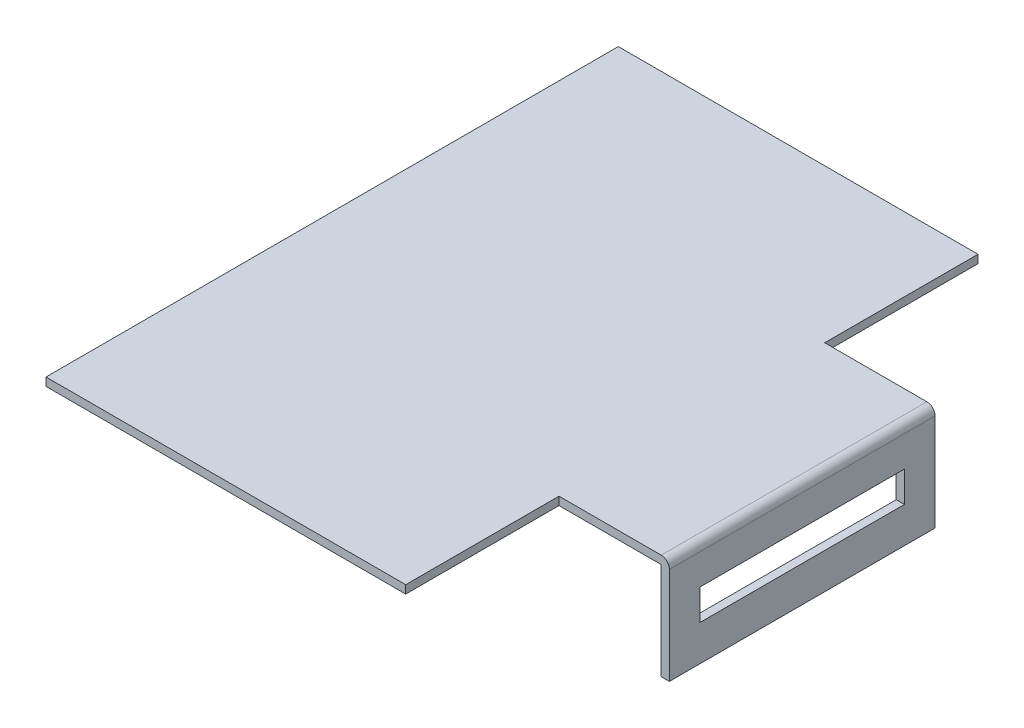
ISO-10303-21;
HEADER;
FILE_DESCRIPTION(('STEP AP214'),'2;1');
FILE_NAME('part.step','',(''),(''),'','','');
FILE_SCHEMA(('AUTOMOTIVE_DESIGN { 1 0 10303 214 1 1 1 1 }'));
ENDSEC;
DATA;
#1=APPLICATION_CONTEXT('core data for automotive mechanical design processes');
#2=APPLICATION_PROTOCOL_DEFINITION('international standard','automotive_design',2000,#1);
#3=PRODUCT_CONTEXT('',#1,'mechanical');
#4=PRODUCT('Part','Part','',(#3));
#5=PRODUCT_RELATED_PRODUCT_CATEGORY('part','',(#4));
#6=PRODUCT_DEFINITION_FORMATION('','',#4);
#7=PRODUCT_DEFINITION_CONTEXT('part definition',#1,'design');
#8=PRODUCT_DEFINITION('design','',#6,#7);
#9=PRODUCT_DEFINITION_SHAPE('','',#8);
#10=(LENGTH_UNIT() NAMED_UNIT(*) SI_UNIT(.MILLI.,.METRE.));
#11=(NAMED_UNIT(*) PLANE_ANGLE_UNIT() SI_UNIT($,.RADIAN.));
#12=(NAMED_UNIT(*) SI_UNIT($,.STERADIAN.) SOLID_ANGLE_UNIT());
#13=UNCERTAINTY_MEASURE_WITH_UNIT(LENGTH_MEASURE(1.E-05),#10,'distance_accuracy_value','');
#14=(GEOMETRIC_REPRESENTATION_CONTEXT(3) GLOBAL_UNCERTAINTY_ASSIGNED_CONTEXT((#13)) GLOBAL_UNIT_ASSIGNED_CONTEXT((#10,
#11,#12)) REPRESENTATION_CONTEXT('',''));
#15=CARTESIAN_POINT('',(0.,0.,0.));
#16=DIRECTION('',(0.,0.,1.));
#17=DIRECTION('',(1.,0.,0.));
#18=AXIS2_PLACEMENT_3D('',#15,#16,#17);
#19=CARTESIAN_POINT('',(11.1,-1.90000000000001,-5.));
#20=DIRECTION('',(0.,0.,-1.));
#21=DIRECTION('',(0.,1.,0.));
#22=AXIS2_PLACEMENT_3D('',#19,#20,#21);
#23=PLANE('',#22);
#24=DIRECTION('',(-1.,0.,0.));
#25=VECTOR('',#24,1.);
#26=CARTESIAN_POINT('',(11.1,-1.90000000000001,-5.));
#27=LINE('',#26,#25);
#28=CARTESIAN_POINT('',(11.5,-1.90000000000001,-5.));
#29=VERTEX_POINT('',#28);
#30=CARTESIAN_POINT('',(11.1,-1.90000000000001,-5.));
#31=VERTEX_POINT('',#30);
#32=EDGE_CURVE('E275',#29,#31,#27,.T.);
#33=ORIENTED_EDGE('',*,*,#32,.T.);
#34=DIRECTION('',(0.,-1.,0.));
#35=VECTOR('',#34,1.);
#36=CARTESIAN_POINT('',(11.1,0.,-5.));
#37=LINE('',#36,#35);
#38=CARTESIAN_POINT('',(11.1,-3.40000000000001,-5.));
#39=VERTEX_POINT('',#38);
#40=EDGE_CURVE('E212',#39,#31,#37,.F.);
#41=ORIENTED_EDGE('',*,*,#40,.F.);
#42=DIRECTION('',(1.,0.,0.));
#43=VECTOR('',#42,1.);
#44=CARTESIAN_POINT('',(11.1,-3.40000000000001,-5.));
#45=LINE('',#44,#43);
#46=CARTESIAN_POINT('',(11.5,-3.4,-5.));
#47=VERTEX_POINT('',#46);
#48=EDGE_CURVE('E261',#39,#47,#45,.T.);
#49=ORIENTED_EDGE('',*,*,#48,.T.);
#50=DIRECTION('',(0.,-1.,0.));
#51=VECTOR('',#50,1.);
#52=CARTESIAN_POINT('',(11.5,0.,-5.));
#53=LINE('',#52,#51);
#54=EDGE_CURVE('E202',#47,#29,#53,.F.);
#55=ORIENTED_EDGE('',*,*,#54,.T.);
#56=EDGE_LOOP('',(#33,#41,#49,#55));
#57=FACE_BOUND('',#56,.T.);
#58=ADVANCED_FACE('F17',(#57),#23,.F.);
#59=CARTESIAN_POINT('',(11.1,-1.90000000000001,5.));
#60=DIRECTION('',(0.,1.,0.));
#61=DIRECTION('',(-1.,0.,0.));
#62=AXIS2_PLACEMENT_3D('',#59,#60,#61);
#63=PLANE('',#62);
#64=DIRECTION('',(1.,0.,0.));
#65=VECTOR('',#64,1.);
#66=CARTESIAN_POINT('',(11.1,-1.9,5.));
#67=LINE('',#66,#65);
#68=CARTESIAN_POINT('',(11.5,-1.90000000000001,5.));
#69=VERTEX_POINT('',#68);
#70=CARTESIAN_POINT('',(11.1,-1.90000000000001,5.));
#71=VERTEX_POINT('',#70);
#72=EDGE_CURVE('E272',#69,#71,#67,.F.);
#73=ORIENTED_EDGE('',*,*,#72,.T.);
#74=DIRECTION('',(0.,0.,1.));
#75=VECTOR('',#74,1.);
#76=CARTESIAN_POINT('',(11.1,-1.90000000000001,0.));
#77=LINE('',#76,#75);
#78=EDGE_CURVE('E205',#31,#71,#77,.T.);
#79=ORIENTED_EDGE('',*,*,#78,.F.);
#80=ORIENTED_EDGE('',*,*,#32,.F.);
#81=DIRECTION('',(0.,0.,1.));
#82=VECTOR('',#81,1.);
#83=CARTESIAN_POINT('',(11.5,-1.9,0.));
#84=LINE('',#83,#82);
#85=EDGE_CURVE('E199',#29,#69,#84,.T.);
#86=ORIENTED_EDGE('',*,*,#85,.T.);
#87=EDGE_LOOP('',(#73,#79,#80,#86));
#88=FACE_BOUND('',#87,.T.);
#89=ADVANCED_FACE('F371',(#88),#63,.F.);
#90=CARTESIAN_POINT('',(11.1,-1.90000000000001,5.));
#91=DIRECTION('',(0.,0.,1.));
#92=DIRECTION('',(0.,-1.,0.));
#93=AXIS2_PLACEMENT_3D('',#90,#91,#92);
#94=PLANE('',#93);
#95=DIRECTION('',(1.,0.,0.));
#96=VECTOR('',#95,1.);
#97=CARTESIAN_POINT('',(11.1,-3.40000000000001,5.));
#98=LINE('',#97,#96);
#99=CARTESIAN_POINT('',(11.5,-3.40000000000001,5.));
#100=VERTEX_POINT('',#99);
#101=CARTESIAN_POINT('',(11.1,-3.40000000000001,5.));
#102=VERTEX_POINT('',#101);
#103=EDGE_CURVE('E269',#100,#102,#98,.F.);
#104=ORIENTED_EDGE('',*,*,#103,.T.);
#105=DIRECTION('',(0.,-1.,0.));
#106=VECTOR('',#105,1.);
#107=CARTESIAN_POINT('',(11.1,0.,5.));
#108=LINE('',#107,#106);
#109=EDGE_CURVE('E218',#71,#102,#108,.T.);
#110=ORIENTED_EDGE('',*,*,#109,.F.);
#111=ORIENTED_EDGE('',*,*,#72,.F.);
#112=DIRECTION('',(0.,-1.,0.));
#113=VECTOR('',#112,1.);
#114=CARTESIAN_POINT('',(11.5,0.,5.));
#115=LINE('',#114,#113);
#116=EDGE_CURVE('E196',#69,#100,#115,.T.);
#117=ORIENTED_EDGE('',*,*,#116,.T.);
#118=EDGE_LOOP('',(#104,#110,#111,#117));
#119=FACE_BOUND('',#118,.T.);
#120=ADVANCED_FACE('F326',(#119),#94,.F.);
#121=CARTESIAN_POINT('',(11.1,-3.40000000000001,5.));
#122=DIRECTION('',(0.,-1.,0.));
#123=DIRECTION('',(1.,0.,0.));
#124=AXIS2_PLACEMENT_3D('',#121,#122,#123);
#125=PLANE('',#124);
#126=ORIENTED_EDGE('',*,*,#48,.F.);
#127=DIRECTION('',(0.,0.,1.));
#128=VECTOR('',#127,1.);
#129=CARTESIAN_POINT('',(11.1,-3.40000000000001,0.));
#130=LINE('',#129,#128);
#131=EDGE_CURVE('E215',#102,#39,#130,.F.);
#132=ORIENTED_EDGE('',*,*,#131,.F.);
#133=ORIENTED_EDGE('',*,*,#103,.F.);
#134=DIRECTION('',(0.,0.,1.));
#135=VECTOR('',#134,1.);
#136=CARTESIAN_POINT('',(11.5,-3.4,0.));
#137=LINE('',#136,#135);
#138=EDGE_CURVE('E193',#100,#47,#137,.F.);
#139=ORIENTED_EDGE('',*,*,#138,.T.);
#140=EDGE_LOOP('',(#126,#132,#133,#139));
#141=FACE_BOUND('',#140,.T.);
#142=ADVANCED_FACE('F318',(#141),#125,.F.);
#143=CARTESIAN_POINT('',(11.5,-5.15,-14.));
#144=DIRECTION('',(0.,1.,0.));
#145=DIRECTION('',(-1.,0.,0.));
#146=AXIS2_PLACEMENT_3D('',#143,#144,#145);
#147=PLANE('',#146);
#148=DIRECTION('',(-1.,0.,0.));
#149=VECTOR('',#148,1.);
#150=CARTESIAN_POINT('',(11.5,-5.15,6.5));
#151=LINE('',#150,#149);
#152=CARTESIAN_POINT('',(11.1,-5.15000000000001,6.5));
#153=VERTEX_POINT('',#152);
#154=CARTESIAN_POINT('',(11.5,-5.15,6.5));
#155=VERTEX_POINT('',#154);
#156=EDGE_CURVE('E252',#153,#155,#151,.F.);
#157=ORIENTED_EDGE('',*,*,#156,.F.);
#158=DIRECTION('',(0.,0.,1.));
#159=VECTOR('',#158,1.);
#160=CARTESIAN_POINT('',(11.1,-5.15000000000002,0.));
#161=LINE('',#160,#159);
#162=CARTESIAN_POINT('',(11.1,-5.15000000000001,-6.5));
#163=VERTEX_POINT('',#162);
#164=EDGE_CURVE('E221',#163,#153,#161,.T.);
#165=ORIENTED_EDGE('',*,*,#164,.F.);
#166=DIRECTION('',(-1.,0.,0.));
#167=VECTOR('',#166,1.);
#168=CARTESIAN_POINT('',(11.5,-5.15,-6.5));
#169=LINE('',#168,#167);
#170=CARTESIAN_POINT('',(11.5,-5.15000000000001,-6.5));
#171=VERTEX_POINT('',#170);
#172=EDGE_CURVE('E259',#171,#163,#169,.T.);
#173=ORIENTED_EDGE('',*,*,#172,.F.);
#174=DIRECTION('',(0.,0.,1.));
#175=VECTOR('',#174,1.);
#176=CARTESIAN_POINT('',(11.5,-5.15000000000001,0.));
#177=LINE('',#176,#175);
#178=EDGE_CURVE('E192',#171,#155,#177,.T.);
#179=ORIENTED_EDGE('',*,*,#178,.T.);
#180=EDGE_LOOP('',(#157,#165,#173,#179));
#181=FACE_BOUND('',#180,.T.);
#182=ADVANCED_FACE('F315',(#181),#147,.F.);
#183=CARTESIAN_POINT('',(0.,-0.399999999999999,0.));
#184=DIRECTION('',(0.,-1.,0.));
#185=DIRECTION('',(1.,0.,0.));
#186=AXIS2_PLACEMENT_3D('',#183,#184,#185);
#187=PLANE('',#186);
#188=DIRECTION('',(0.,0.,1.));
#189=VECTOR('',#188,1.);
#190=CARTESIAN_POINT('',(-11.5,-0.400000000000003,14.));
#191=LINE('',#190,#189);
#192=CARTESIAN_POINT('',(-11.5,-0.4,-14.));
#193=VERTEX_POINT('',#192);
#194=CARTESIAN_POINT('',(-11.5,-0.400000000000003,14.));
#195=VERTEX_POINT('',#194);
#196=EDGE_CURVE('E165',#193,#195,#191,.T.);
#197=ORIENTED_EDGE('',*,*,#196,.F.);
#198=DIRECTION('',(1.,0.,0.));
#199=VECTOR('',#198,1.);
#200=CARTESIAN_POINT('',(-11.5,-0.399999999999999,-14.));
#201=LINE('',#200,#199);
#202=CARTESIAN_POINT('',(6.09999999999999,-0.399999999999999,-14.));
#203=VERTEX_POINT('',#202);
#204=EDGE_CURVE('E155',#203,#193,#201,.F.);
#205=ORIENTED_EDGE('',*,*,#204,.F.);
#206=DIRECTION('',(0.,0.,1.));
#207=VECTOR('',#206,1.);
#208=CARTESIAN_POINT('',(6.09999999999999,-0.399999999999999,-6.5));
#209=LINE('',#208,#207);
#210=CARTESIAN_POINT('',(6.09999999999999,-0.399999999999999,-6.5));
#211=VERTEX_POINT('',#210);
#212=EDGE_CURVE('E135',#203,#211,#209,.T.);
#213=ORIENTED_EDGE('',*,*,#212,.T.);
#214=DIRECTION('',(1.,0.,0.));
#215=VECTOR('',#214,1.);
#216=CARTESIAN_POINT('',(11.1,-0.399999999999999,-6.5));
#217=LINE('',#216,#215);
#218=CARTESIAN_POINT('',(11.1,-0.400000000000002,-6.5));
#219=VERTEX_POINT('',#218);
#220=EDGE_CURVE('E134',#211,#219,#217,.T.);
#221=ORIENTED_EDGE('',*,*,#220,.T.);
#222=DIRECTION('',(0.,0.,1.));
#223=VECTOR('',#222,1.);
#224=CARTESIAN_POINT('',(11.1,-0.400000000000005,0.));
#225=LINE('',#224,#223);
#226=CARTESIAN_POINT('',(11.1,-0.400000000000005,6.5));
#227=VERTEX_POINT('',#226);
#228=EDGE_CURVE('E250',#227,#219,#225,.F.);
#229=ORIENTED_EDGE('',*,*,#228,.F.);
#230=DIRECTION('',(1.,0.,0.));
#231=VECTOR('',#230,1.);
#232=CARTESIAN_POINT('',(11.1,-0.400000000000005,6.5));
#233=LINE('',#232,#231);
#234=CARTESIAN_POINT('',(6.09999999999999,-0.400000000000001,6.5));
#235=VERTEX_POINT('',#234);
#236=EDGE_CURVE('E111',#227,#235,#233,.F.);
#237=ORIENTED_EDGE('',*,*,#236,.T.);
#238=DIRECTION('',(0.,0.,1.));
#239=VECTOR('',#238,1.);
#240=CARTESIAN_POINT('',(6.09999999999999,-0.399999999999999,14.));
#241=LINE('',#240,#239);
#242=CARTESIAN_POINT('',(6.09999999999998,-0.400000000000002,14.));
#243=VERTEX_POINT('',#242);
#244=EDGE_CURVE('E175',#235,#243,#241,.T.);
#245=ORIENTED_EDGE('',*,*,#244,.T.);
#246=DIRECTION('',(1.,0.,0.));
#247=VECTOR('',#246,1.);
#248=CARTESIAN_POINT('',(-11.5,-0.400000000000003,14.));
#249=LINE('',#248,#247);
#250=EDGE_CURVE('E174',#195,#243,#249,.T.);
#251=ORIENTED_EDGE('',*,*,#250,.F.);
#252=EDGE_LOOP('',(#197,#205,#213,#221,#229,#237,#245,#251));
#253=FACE_BOUND('',#252,.T.);
#254=ADVANCED_FACE('F317',(#253),#187,.T.);
#255=CARTESIAN_POINT('',(11.1,0.,0.));
#256=DIRECTION('',(-1.,0.,0.));
#257=DIRECTION('',(0.,-1.,0.));
#258=AXIS2_PLACEMENT_3D('',#255,#256,#257);
#259=PLANE('',#258);
#260=ORIENTED_EDGE('',*,*,#40,.T.);
#261=ORIENTED_EDGE('',*,*,#78,.T.);
#262=ORIENTED_EDGE('',*,*,#109,.T.);
#263=ORIENTED_EDGE('',*,*,#131,.T.);
#264=EDGE_LOOP('',(#260,#261,#262,#263));
#265=FACE_BOUND('',#264,.T.);
#266=DIRECTION('',(0.,-1.,0.));
#267=VECTOR('',#266,1.);
#268=CARTESIAN_POINT('',(11.1,-5.15000000000002,-6.5));
#269=LINE('',#268,#267);
#270=EDGE_CURVE('E227',#219,#163,#269,.T.);
#271=ORIENTED_EDGE('',*,*,#270,.T.);
#272=ORIENTED_EDGE('',*,*,#164,.T.);
#273=DIRECTION('',(0.,1.,0.));
#274=VECTOR('',#273,1.);
#275=CARTESIAN_POINT('',(11.1,-5.15000000000002,6.5));
#276=LINE('',#275,#274);
#277=EDGE_CURVE('E187',#153,#227,#276,.T.);
#278=ORIENTED_EDGE('',*,*,#277,.T.);
#279=ORIENTED_EDGE('',*,*,#228,.T.);
#280=EDGE_LOOP('',(#271,#272,#278,#279));
#281=FACE_BOUND('',#280,.T.);
#282=ADVANCED_FACE('F313',(#265,#281),#259,.T.);
#283=CARTESIAN_POINT('',(11.5,0.,0.));
#284=DIRECTION('',(-1.,0.,0.));
#285=DIRECTION('',(0.,-1.,0.));
#286=AXIS2_PLACEMENT_3D('',#283,#284,#285);
#287=PLANE('',#286);
#288=DIRECTION('',(0.,1.,0.));
#289=VECTOR('',#288,1.);
#290=CARTESIAN_POINT('',(11.5,-5.15000000000002,6.5));
#291=LINE('',#290,#289);
#292=CARTESIAN_POINT('',(11.5,-0.399999999999999,6.5));
#293=VERTEX_POINT('',#292);
#294=EDGE_CURVE('E106',#293,#155,#291,.F.);
#295=ORIENTED_EDGE('',*,*,#294,.T.);
#296=ORIENTED_EDGE('',*,*,#178,.F.);
#297=DIRECTION('',(0.,-1.,0.));
#298=VECTOR('',#297,1.);
#299=CARTESIAN_POINT('',(11.5,-5.15000000000002,-6.5));
#300=LINE('',#299,#298);
#301=CARTESIAN_POINT('',(11.5,-0.399999999999999,-6.5));
#302=VERTEX_POINT('',#301);
#303=EDGE_CURVE('E126',#171,#302,#300,.F.);
#304=ORIENTED_EDGE('',*,*,#303,.T.);
#305=DIRECTION('',(0.,0.,-1.));
#306=VECTOR('',#305,1.);
#307=CARTESIAN_POINT('',(11.5,-0.399999999999993,-14.));
#308=LINE('',#307,#306);
#309=EDGE_CURVE('E188',#293,#302,#308,.T.);
#310=ORIENTED_EDGE('',*,*,#309,.F.);
#311=EDGE_LOOP('',(#295,#296,#304,#310));
#312=FACE_BOUND('',#311,.T.);
#313=ORIENTED_EDGE('',*,*,#116,.F.);
#314=ORIENTED_EDGE('',*,*,#85,.F.);
#315=ORIENTED_EDGE('',*,*,#54,.F.);
#316=ORIENTED_EDGE('',*,*,#138,.F.);
#317=EDGE_LOOP('',(#313,#314,#315,#316));
#318=FACE_BOUND('',#317,.T.);
#319=ADVANCED_FACE('F287',(#312,#318),#287,.F.);
#320=CARTESIAN_POINT('',(11.1,-0.400000000000005,-14.));
#321=DIRECTION('',(0.,0.,-1.));
#322=DIRECTION('',(0.,1.,0.));
#323=AXIS2_PLACEMENT_3D('',#320,#321,#322);
#324=CYLINDRICAL_SURFACE('',#323,0.399999999999999);
#325=CARTESIAN_POINT('',(11.1,-0.400000000000005,-6.5));
#326=DIRECTION('',(0.,0.,-1.));
#327=DIRECTION('',(0.,1.,0.));
#328=AXIS2_PLACEMENT_3D('',#325,#326,#327);
#329=CIRCLE('',#328,0.399999999999999);
#330=CARTESIAN_POINT('',(11.1,0.,-6.5));
#331=VERTEX_POINT('',#330);
#332=EDGE_CURVE('E124',#302,#331,#329,.F.);
#333=ORIENTED_EDGE('',*,*,#332,.T.);
#334=DIRECTION('',(0.,0.,1.));
#335=VECTOR('',#334,1.);
#336=CARTESIAN_POINT('',(11.1,0.,0.));
#337=LINE('',#336,#335);
#338=CARTESIAN_POINT('',(11.1,0.,6.5));
#339=VERTEX_POINT('',#338);
#340=EDGE_CURVE('E116',#331,#339,#337,.T.);
#341=ORIENTED_EDGE('',*,*,#340,.T.);
#342=CARTESIAN_POINT('',(11.1,-0.400000000000005,6.5));
#343=DIRECTION('',(0.,0.,-1.));
#344=DIRECTION('',(0.,1.,0.));
#345=AXIS2_PLACEMENT_3D('',#342,#343,#344);
#346=CIRCLE('',#345,0.399999999999999);
#347=EDGE_CURVE('E20',#339,#293,#346,.T.);
#348=ORIENTED_EDGE('',*,*,#347,.T.);
#349=ORIENTED_EDGE('',*,*,#309,.T.);
#350=EDGE_LOOP('',(#333,#341,#348,#349));
#351=FACE_BOUND('',#350,.T.);
#352=ADVANCED_FACE('F122',(#351),#324,.T.);
#353=CARTESIAN_POINT('',(11.1,-5.15000000000002,6.5));
#354=DIRECTION('',(0.,0.,-1.));
#355=DIRECTION('',(0.,1.,0.));
#356=AXIS2_PLACEMENT_3D('',#353,#354,#355);
#357=PLANE('',#356);
#358=DIRECTION('',(1.,0.,0.));
#359=VECTOR('',#358,1.);
#360=CARTESIAN_POINT('',(0.,0.,6.5));
#361=LINE('',#360,#359);
#362=CARTESIAN_POINT('',(6.09999999999999,0.,6.5));
#363=VERTEX_POINT('',#362);
#364=EDGE_CURVE('E104',#339,#363,#361,.F.);
#365=ORIENTED_EDGE('',*,*,#364,.T.);
#366=DIRECTION('',(0.,1.,0.));
#367=VECTOR('',#366,1.);
#368=CARTESIAN_POINT('',(6.09999999999999,-0.399999999999999,6.5));
#369=LINE('',#368,#367);
#370=EDGE_CURVE('E110',#363,#235,#369,.F.);
#371=ORIENTED_EDGE('',*,*,#370,.T.);
#372=ORIENTED_EDGE('',*,*,#236,.F.);
#373=ORIENTED_EDGE('',*,*,#277,.F.);
#374=ORIENTED_EDGE('',*,*,#156,.T.);
#375=ORIENTED_EDGE('',*,*,#294,.F.);
#376=ORIENTED_EDGE('',*,*,#347,.F.);
#377=EDGE_LOOP('',(#365,#371,#372,#373,#374,#375,#376));
#378=FACE_BOUND('',#377,.T.);
#379=ADVANCED_FACE('F102',(#378),#357,.F.);
#380=CARTESIAN_POINT('',(6.09999999999999,-0.399999999999999,14.));
#381=DIRECTION('',(-1.,0.,0.));
#382=DIRECTION('',(0.,0.,1.));
#383=AXIS2_PLACEMENT_3D('',#380,#381,#382);
#384=PLANE('',#383);
#385=DIRECTION('',(0.,-1.,0.));
#386=VECTOR('',#385,1.);
#387=CARTESIAN_POINT('',(6.09999999999999,-0.400000000000003,14.));
#388=LINE('',#387,#386);
#389=CARTESIAN_POINT('',(6.09999999999999,0.,14.));
#390=VERTEX_POINT('',#389);
#391=EDGE_CURVE('E172',#243,#390,#388,.F.);
#392=ORIENTED_EDGE('',*,*,#391,.F.);
#393=ORIENTED_EDGE('',*,*,#244,.F.);
#394=ORIENTED_EDGE('',*,*,#370,.F.);
#395=DIRECTION('',(0.,0.,1.));
#396=VECTOR('',#395,1.);
#397=CARTESIAN_POINT('',(6.1,0.,0.));
#398=LINE('',#397,#396);
#399=EDGE_CURVE('E120',#363,#390,#398,.T.);
#400=ORIENTED_EDGE('',*,*,#399,.T.);
#401=EDGE_LOOP('',(#392,#393,#394,#400));
#402=FACE_BOUND('',#401,.T.);
#403=ADVANCED_FACE('F308',(#402),#384,.F.);
#404=CARTESIAN_POINT('',(-11.5,-0.400000000000003,14.));
#405=DIRECTION('',(0.,0.,1.));
#406=DIRECTION('',(0.,-1.,0.));
#407=AXIS2_PLACEMENT_3D('',#404,#405,#406);
#408=PLANE('',#407);
#409=DIRECTION('',(0.,-1.,0.));
#410=VECTOR('',#409,1.);
#411=CARTESIAN_POINT('',(-11.5,-0.400000000000003,14.));
#412=LINE('',#411,#410);
#413=CARTESIAN_POINT('',(-11.5,0.,14.));
#414=VERTEX_POINT('',#413);
#415=EDGE_CURVE('E163',#195,#414,#412,.F.);
#416=ORIENTED_EDGE('',*,*,#415,.F.);
#417=ORIENTED_EDGE('',*,*,#250,.T.);
#418=ORIENTED_EDGE('',*,*,#391,.T.);
#419=DIRECTION('',(1.,0.,0.));
#420=VECTOR('',#419,1.);
#421=CARTESIAN_POINT('',(0.,0.,14.));
#422=LINE('',#421,#420);
#423=EDGE_CURVE('E160',#390,#414,#422,.F.);
#424=ORIENTED_EDGE('',*,*,#423,.T.);
#425=EDGE_LOOP('',(#416,#417,#418,#424));
#426=FACE_BOUND('',#425,.T.);
#427=ADVANCED_FACE('F305',(#426),#408,.T.);
#428=CARTESIAN_POINT('',(-11.5,-0.400000000000003,14.));
#429=DIRECTION('',(-1.,0.,0.));
#430=DIRECTION('',(0.,-1.,0.));
#431=AXIS2_PLACEMENT_3D('',#428,#429,#430);
#432=PLANE('',#431);
#433=ORIENTED_EDGE('',*,*,#196,.T.);
#434=ORIENTED_EDGE('',*,*,#415,.T.);
#435=DIRECTION('',(0.,0.,1.));
#436=VECTOR('',#435,1.);
#437=CARTESIAN_POINT('',(-11.5,0.,0.));
#438=LINE('',#437,#436);
#439=CARTESIAN_POINT('',(-11.5,0.,-14.));
#440=VERTEX_POINT('',#439);
#441=EDGE_CURVE('E151',#414,#440,#438,.F.);
#442=ORIENTED_EDGE('',*,*,#441,.T.);
#443=DIRECTION('',(0.,1.,0.));
#444=VECTOR('',#443,1.);
#445=CARTESIAN_POINT('',(-11.5,-0.400000000000003,-14.));
#446=LINE('',#445,#444);
#447=EDGE_CURVE('E146',#193,#440,#446,.T.);
#448=ORIENTED_EDGE('',*,*,#447,.F.);
#449=EDGE_LOOP('',(#433,#434,#442,#448));
#450=FACE_BOUND('',#449,.T.);
#451=ADVANCED_FACE('F301',(#450),#432,.T.);
#452=CARTESIAN_POINT('',(-11.5,-0.400000000000003,-14.));
#453=DIRECTION('',(0.,0.,-1.));
#454=DIRECTION('',(0.,1.,0.));
#455=AXIS2_PLACEMENT_3D('',#452,#453,#454);
#456=PLANE('',#455);
#457=ORIENTED_EDGE('',*,*,#447,.T.);
#458=DIRECTION('',(1.,0.,0.));
#459=VECTOR('',#458,1.);
#460=CARTESIAN_POINT('',(0.,0.,-14.));
#461=LINE('',#460,#459);
#462=CARTESIAN_POINT('',(6.09999999999999,0.,-14.));
#463=VERTEX_POINT('',#462);
#464=EDGE_CURVE('E140',#440,#463,#461,.T.);
#465=ORIENTED_EDGE('',*,*,#464,.T.);
#466=DIRECTION('',(0.,-1.,0.));
#467=VECTOR('',#466,1.);
#468=CARTESIAN_POINT('',(6.09999999999999,-0.399999999999999,-14.));
#469=LINE('',#468,#467);
#470=EDGE_CURVE('E143',#463,#203,#469,.T.);
#471=ORIENTED_EDGE('',*,*,#470,.T.);
#472=ORIENTED_EDGE('',*,*,#204,.T.);
#473=EDGE_LOOP('',(#457,#465,#471,#472));
#474=FACE_BOUND('',#473,.T.);
#475=ADVANCED_FACE('F296',(#474),#456,.T.);
#476=CARTESIAN_POINT('',(6.09999999999999,-0.399999999999999,-6.5));
#477=DIRECTION('',(-1.,0.,0.));
#478=DIRECTION('',(0.,-1.,0.));
#479=AXIS2_PLACEMENT_3D('',#476,#477,#478);
#480=PLANE('',#479);
#481=DIRECTION('',(0.,-1.,0.));
#482=VECTOR('',#481,1.);
#483=CARTESIAN_POINT('',(6.1,-5.15000000000002,-6.5));
#484=LINE('',#483,#482);
#485=CARTESIAN_POINT('',(6.1,0.,-6.5));
#486=VERTEX_POINT('',#485);
#487=EDGE_CURVE('E34',#486,#211,#484,.T.);
#488=ORIENTED_EDGE('',*,*,#487,.T.);
#489=ORIENTED_EDGE('',*,*,#212,.F.);
#490=ORIENTED_EDGE('',*,*,#470,.F.);
#491=DIRECTION('',(0.,0.,1.));
#492=VECTOR('',#491,1.);
#493=CARTESIAN_POINT('',(6.1,0.,0.));
#494=LINE('',#493,#492);
#495=EDGE_CURVE('E26',#463,#486,#494,.T.);
#496=ORIENTED_EDGE('',*,*,#495,.T.);
#497=EDGE_LOOP('',(#488,#489,#490,#496));
#498=FACE_BOUND('',#497,.T.);
#499=ADVANCED_FACE('F293',(#498),#480,.F.);
#500=CARTESIAN_POINT('',(11.1,-5.15000000000002,-6.5));
#501=DIRECTION('',(0.,0.,1.));
#502=DIRECTION('',(0.,-1.,0.));
#503=AXIS2_PLACEMENT_3D('',#500,#501,#502);
#504=PLANE('',#503);
#505=ORIENTED_EDGE('',*,*,#303,.F.);
#506=ORIENTED_EDGE('',*,*,#172,.T.);
#507=ORIENTED_EDGE('',*,*,#270,.F.);
#508=ORIENTED_EDGE('',*,*,#220,.F.);
#509=ORIENTED_EDGE('',*,*,#487,.F.);
#510=DIRECTION('',(1.,0.,0.));
#511=VECTOR('',#510,1.);
#512=CARTESIAN_POINT('',(0.,0.,-6.5));
#513=LINE('',#512,#511);
#514=EDGE_CURVE('E11',#486,#331,#513,.T.);
#515=ORIENTED_EDGE('',*,*,#514,.T.);
#516=ORIENTED_EDGE('',*,*,#332,.F.);
#517=EDGE_LOOP('',(#505,#506,#507,#508,#509,#515,#516));
#518=FACE_BOUND('',#517,.T.);
#519=ADVANCED_FACE('F289',(#518),#504,.F.);
#520=CARTESIAN_POINT('',(0.,0.,0.));
#521=DIRECTION('',(0.,-1.,0.));
#522=DIRECTION('',(1.,0.,0.));
#523=AXIS2_PLACEMENT_3D('',#520,#521,#522);
#524=PLANE('',#523);
#525=ORIENTED_EDGE('',*,*,#495,.F.);
#526=ORIENTED_EDGE('',*,*,#464,.F.);
#527=ORIENTED_EDGE('',*,*,#441,.F.);
#528=ORIENTED_EDGE('',*,*,#423,.F.);
#529=ORIENTED_EDGE('',*,*,#399,.F.);
#530=ORIENTED_EDGE('',*,*,#364,.F.);
#531=ORIENTED_EDGE('',*,*,#340,.F.);
#532=ORIENTED_EDGE('',*,*,#514,.F.);
#533=EDGE_LOOP('',(#525,#526,#527,#528,#529,#530,#531,#532));
#534=FACE_BOUND('',#533,.T.);
#535=ADVANCED_FACE('F115',(#534),#524,.F.);
#536=CLOSED_SHELL('',(#58,#89,#120,#142,#182,#254,#282,#319,#352,#379,#403,#427,#451,#475,#499,
#519,#535));
#537=MANIFOLD_SOLID_BREP('B1',#536);
#538=ADVANCED_BREP_SHAPE_REPRESENTATION('',(#18,#537),#14);
#539=SHAPE_DEFINITION_REPRESENTATION(#9,#538);
ENDSEC;
END-ISO-10303-21;
